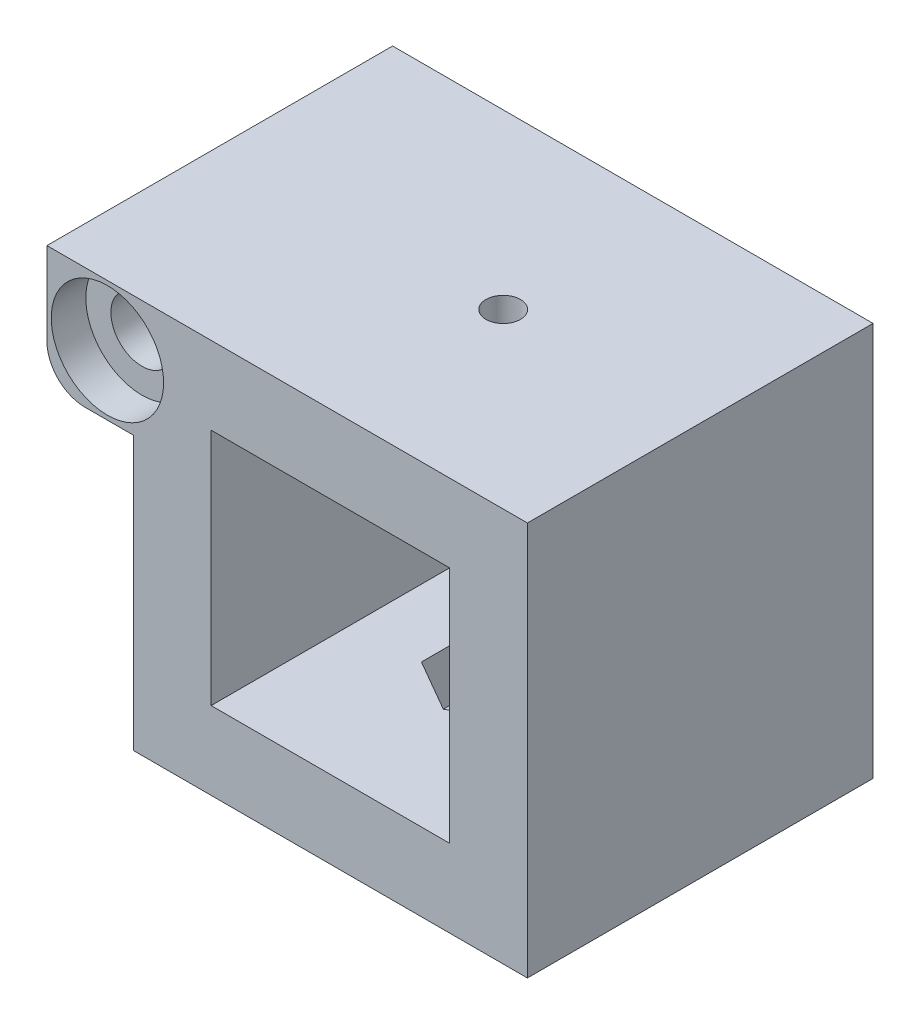
ISO-10303-21;
HEADER;
FILE_DESCRIPTION(('STEP AP214'),'2;1');
FILE_NAME('part.step','',(''),(''),'','','');
FILE_SCHEMA(('AUTOMOTIVE_DESIGN { 1 0 10303 214 1 1 1 1 }'));
ENDSEC;
DATA;
#1=APPLICATION_CONTEXT('core data for automotive mechanical design processes');
#2=APPLICATION_PROTOCOL_DEFINITION('international standard','automotive_design',2000,#1);
#3=PRODUCT_CONTEXT('',#1,'mechanical');
#4=PRODUCT('Part','Part','',(#3));
#5=PRODUCT_RELATED_PRODUCT_CATEGORY('part','',(#4));
#6=PRODUCT_DEFINITION_FORMATION('','',#4);
#7=PRODUCT_DEFINITION_CONTEXT('part definition',#1,'design');
#8=PRODUCT_DEFINITION('design','',#6,#7);
#9=PRODUCT_DEFINITION_SHAPE('','',#8);
#10=(LENGTH_UNIT() NAMED_UNIT(*) SI_UNIT(.MILLI.,.METRE.));
#11=(NAMED_UNIT(*) PLANE_ANGLE_UNIT() SI_UNIT($,.RADIAN.));
#12=(NAMED_UNIT(*) SI_UNIT($,.STERADIAN.) SOLID_ANGLE_UNIT());
#13=UNCERTAINTY_MEASURE_WITH_UNIT(LENGTH_MEASURE(1.E-05),#10,'distance_accuracy_value','');
#14=(GEOMETRIC_REPRESENTATION_CONTEXT(3) GLOBAL_UNCERTAINTY_ASSIGNED_CONTEXT((#13)) GLOBAL_UNIT_ASSIGNED_CONTEXT((#10,
#11,#12)) REPRESENTATION_CONTEXT('',''));
#15=CARTESIAN_POINT('',(0.,0.,0.));
#16=DIRECTION('',(0.,0.,1.));
#17=DIRECTION('',(1.,0.,0.));
#18=AXIS2_PLACEMENT_3D('',#15,#16,#17);
#19=CARTESIAN_POINT('',(-11.4,-11.4,10.));
#20=DIRECTION('',(1.,0.,0.));
#21=DIRECTION('',(0.,0.,-1.));
#22=AXIS2_PLACEMENT_3D('',#19,#20,#21);
#23=PLANE('',#22);
#24=DIRECTION('',(0.,-1.,0.));
#25=VECTOR('',#24,1.);
#26=CARTESIAN_POINT('',(-11.4,-11.4,10.));
#27=LINE('',#26,#25);
#28=CARTESIAN_POINT('',(-11.4,4.4,10.));
#29=VERTEX_POINT('',#28);
#30=CARTESIAN_POINT('',(-11.4,-11.4,10.));
#31=VERTEX_POINT('',#30);
#32=EDGE_CURVE('E165',#29,#31,#27,.T.);
#33=ORIENTED_EDGE('',*,*,#32,.F.);
#34=DIRECTION('',(0.,0.,-1.));
#35=VECTOR('',#34,1.);
#36=CARTESIAN_POINT('',(-11.4,4.4,10.));
#37=LINE('',#36,#35);
#38=CARTESIAN_POINT('',(-11.4,4.4,-10.));
#39=VERTEX_POINT('',#38);
#40=EDGE_CURVE('E170',#29,#39,#37,.T.);
#41=ORIENTED_EDGE('',*,*,#40,.T.);
#42=DIRECTION('',(0.,-1.,0.));
#43=VECTOR('',#42,1.);
#44=CARTESIAN_POINT('',(-11.4,-11.4,-10.));
#45=LINE('',#44,#43);
#46=CARTESIAN_POINT('',(-11.4,-11.4,-10.));
#47=VERTEX_POINT('',#46);
#48=EDGE_CURVE('E269',#39,#47,#45,.T.);
#49=ORIENTED_EDGE('',*,*,#48,.T.);
#50=DIRECTION('',(0.,0.,-1.));
#51=VECTOR('',#50,1.);
#52=CARTESIAN_POINT('',(-11.4,-11.4,10.));
#53=LINE('',#52,#51);
#54=EDGE_CURVE('E272',#31,#47,#53,.T.);
#55=ORIENTED_EDGE('',*,*,#54,.F.);
#56=EDGE_LOOP('',(#33,#41,#49,#55));
#57=FACE_BOUND('',#56,.T.);
#58=ADVANCED_FACE('F35',(#57),#23,.F.);
#59=CARTESIAN_POINT('',(0.,0.,10.));
#60=DIRECTION('',(0.,0.,1.));
#61=DIRECTION('',(1.,0.,0.));
#62=AXIS2_PLACEMENT_3D('',#59,#60,#61);
#63=PLANE('',#62);
#64=CARTESIAN_POINT('',(-12.9,7.9,10.));
#65=DIRECTION('',(0.,0.,1.));
#66=DIRECTION('',(1.,0.,0.));
#67=AXIS2_PLACEMENT_3D('',#64,#65,#66);
#68=CIRCLE('',#67,3.25);
#69=CARTESIAN_POINT('',(-9.65,7.9,10.));
#70=VERTEX_POINT('',#69);
#71=EDGE_CURVE('E315',#70,#70,#68,.T.);
#72=ORIENTED_EDGE('',*,*,#71,.F.);
#73=EDGE_LOOP('',(#72));
#74=FACE_BOUND('',#73,.T.);
#75=DIRECTION('',(0.,-1.,0.));
#76=VECTOR('',#75,1.);
#77=CARTESIAN_POINT('',(-16.4,0.,10.));
#78=LINE('',#77,#76);
#79=CARTESIAN_POINT('',(-16.4,11.4,10.));
#80=VERTEX_POINT('',#79);
#81=CARTESIAN_POINT('',(-16.4,6.6,10.));
#82=VERTEX_POINT('',#81);
#83=EDGE_CURVE('E157',#80,#82,#78,.T.);
#84=ORIENTED_EDGE('',*,*,#83,.T.);
#85=CARTESIAN_POINT('',(-14.2,6.6,10.));
#86=DIRECTION('',(0.,0.,1.));
#87=DIRECTION('',(1.,0.,0.));
#88=AXIS2_PLACEMENT_3D('',#85,#86,#87);
#89=CIRCLE('',#88,2.2);
#90=CARTESIAN_POINT('',(-14.2,4.4,10.));
#91=VERTEX_POINT('',#90);
#92=EDGE_CURVE('E11',#82,#91,#89,.T.);
#93=ORIENTED_EDGE('',*,*,#92,.T.);
#94=DIRECTION('',(-1.,0.,0.));
#95=VECTOR('',#94,1.);
#96=CARTESIAN_POINT('',(0.,4.4,10.));
#97=LINE('',#96,#95);
#98=EDGE_CURVE('E171',#29,#91,#97,.T.);
#99=ORIENTED_EDGE('',*,*,#98,.F.);
#100=ORIENTED_EDGE('',*,*,#32,.T.);
#101=DIRECTION('',(1.,0.,0.));
#102=VECTOR('',#101,1.);
#103=CARTESIAN_POINT('',(-11.4,-11.4,10.));
#104=LINE('',#103,#102);
#105=CARTESIAN_POINT('',(11.4,-11.4,10.));
#106=VERTEX_POINT('',#105);
#107=EDGE_CURVE('E267',#31,#106,#104,.T.);
#108=ORIENTED_EDGE('',*,*,#107,.T.);
#109=DIRECTION('',(0.,1.,0.));
#110=VECTOR('',#109,1.);
#111=CARTESIAN_POINT('',(11.4,-11.4,10.));
#112=LINE('',#111,#110);
#113=CARTESIAN_POINT('',(11.4,11.4,10.));
#114=VERTEX_POINT('',#113);
#115=EDGE_CURVE('E160',#106,#114,#112,.T.);
#116=ORIENTED_EDGE('',*,*,#115,.T.);
#117=DIRECTION('',(-1.,0.,0.));
#118=VECTOR('',#117,1.);
#119=CARTESIAN_POINT('',(-11.4,11.4,10.));
#120=LINE('',#119,#118);
#121=EDGE_CURVE('E154',#114,#80,#120,.T.);
#122=ORIENTED_EDGE('',*,*,#121,.T.);
#123=EDGE_LOOP('',(#84,#93,#99,#100,#108,#116,#122));
#124=FACE_BOUND('',#123,.T.);
#125=DIRECTION('',(-1.,0.,0.));
#126=VECTOR('',#125,1.);
#127=CARTESIAN_POINT('',(-6.9,6.9,10.));
#128=LINE('',#127,#126);
#129=CARTESIAN_POINT('',(6.9,6.9,10.));
#130=VERTEX_POINT('',#129);
#131=CARTESIAN_POINT('',(-6.9,6.9,10.));
#132=VERTEX_POINT('',#131);
#133=EDGE_CURVE('E238',#130,#132,#128,.T.);
#134=ORIENTED_EDGE('',*,*,#133,.F.);
#135=DIRECTION('',(0.,1.,0.));
#136=VECTOR('',#135,1.);
#137=CARTESIAN_POINT('',(6.9,-6.9,10.));
#138=LINE('',#137,#136);
#139=CARTESIAN_POINT('',(6.9,-6.9,10.));
#140=VERTEX_POINT('',#139);
#141=EDGE_CURVE('E236',#140,#130,#138,.T.);
#142=ORIENTED_EDGE('',*,*,#141,.F.);
#143=DIRECTION('',(1.,0.,0.));
#144=VECTOR('',#143,1.);
#145=CARTESIAN_POINT('',(-6.9,-6.9,10.));
#146=LINE('',#145,#144);
#147=CARTESIAN_POINT('',(-6.9,-6.9,10.));
#148=VERTEX_POINT('',#147);
#149=EDGE_CURVE('E244',#148,#140,#146,.T.);
#150=ORIENTED_EDGE('',*,*,#149,.F.);
#151=DIRECTION('',(0.,-1.,0.));
#152=VECTOR('',#151,1.);
#153=CARTESIAN_POINT('',(-6.9,-6.9,10.));
#154=LINE('',#153,#152);
#155=EDGE_CURVE('E241',#132,#148,#154,.T.);
#156=ORIENTED_EDGE('',*,*,#155,.F.);
#157=EDGE_LOOP('',(#134,#142,#150,#156));
#158=FACE_BOUND('',#157,.T.);
#159=ADVANCED_FACE('F155',(#74,#124,#158),#63,.T.);
#160=CARTESIAN_POINT('',(0.,0.,-10.));
#161=DIRECTION('',(0.,0.,1.));
#162=DIRECTION('',(1.,0.,0.));
#163=AXIS2_PLACEMENT_3D('',#160,#161,#162);
#164=PLANE('',#163);
#165=CARTESIAN_POINT('',(-12.9,7.9,-10.));
#166=DIRECTION('',(0.,0.,1.));
#167=DIRECTION('',(1.,0.,0.));
#168=AXIS2_PLACEMENT_3D('',#165,#166,#167);
#169=CIRCLE('',#168,1.79999999999999);
#170=CARTESIAN_POINT('',(-11.1,7.9,-10.));
#171=VERTEX_POINT('',#170);
#172=EDGE_CURVE('E304',#171,#171,#169,.T.);
#173=ORIENTED_EDGE('',*,*,#172,.T.);
#174=EDGE_LOOP('',(#173));
#175=FACE_BOUND('',#174,.T.);
#176=DIRECTION('',(-1.,0.,0.));
#177=VECTOR('',#176,1.);
#178=CARTESIAN_POINT('',(0.,4.4,-10.));
#179=LINE('',#178,#177);
#180=CARTESIAN_POINT('',(-14.2,4.4,-10.));
#181=VERTEX_POINT('',#180);
#182=EDGE_CURVE('E298',#39,#181,#179,.T.);
#183=ORIENTED_EDGE('',*,*,#182,.T.);
#184=CARTESIAN_POINT('',(-14.2,6.6,-10.));
#185=DIRECTION('',(0.,0.,1.));
#186=DIRECTION('',(1.,0.,0.));
#187=AXIS2_PLACEMENT_3D('',#184,#185,#186);
#188=CIRCLE('',#187,2.2);
#189=CARTESIAN_POINT('',(-16.4,6.6,-10.));
#190=VERTEX_POINT('',#189);
#191=EDGE_CURVE('E58',#181,#190,#188,.F.);
#192=ORIENTED_EDGE('',*,*,#191,.T.);
#193=DIRECTION('',(0.,-1.,0.));
#194=VECTOR('',#193,1.);
#195=CARTESIAN_POINT('',(-16.4,0.,-10.));
#196=LINE('',#195,#194);
#197=CARTESIAN_POINT('',(-16.4,11.4,-10.));
#198=VERTEX_POINT('',#197);
#199=EDGE_CURVE('E184',#198,#190,#196,.T.);
#200=ORIENTED_EDGE('',*,*,#199,.F.);
#201=DIRECTION('',(-1.,0.,0.));
#202=VECTOR('',#201,1.);
#203=CARTESIAN_POINT('',(-11.4,11.4,-10.));
#204=LINE('',#203,#202);
#205=CARTESIAN_POINT('',(11.4,11.4,-10.));
#206=VERTEX_POINT('',#205);
#207=EDGE_CURVE('E175',#206,#198,#204,.T.);
#208=ORIENTED_EDGE('',*,*,#207,.F.);
#209=DIRECTION('',(0.,1.,0.));
#210=VECTOR('',#209,1.);
#211=CARTESIAN_POINT('',(11.4,-11.4,-10.));
#212=LINE('',#211,#210);
#213=CARTESIAN_POINT('',(11.4,-11.4,-10.));
#214=VERTEX_POINT('',#213);
#215=EDGE_CURVE('E275',#214,#206,#212,.T.);
#216=ORIENTED_EDGE('',*,*,#215,.F.);
#217=DIRECTION('',(1.,0.,0.));
#218=VECTOR('',#217,1.);
#219=CARTESIAN_POINT('',(-11.4,-11.4,-10.));
#220=LINE('',#219,#218);
#221=EDGE_CURVE('E266',#47,#214,#220,.T.);
#222=ORIENTED_EDGE('',*,*,#221,.F.);
#223=ORIENTED_EDGE('',*,*,#48,.F.);
#224=EDGE_LOOP('',(#183,#192,#200,#208,#216,#222,#223));
#225=FACE_BOUND('',#224,.T.);
#226=DIRECTION('',(0.,1.,0.));
#227=VECTOR('',#226,1.);
#228=CARTESIAN_POINT('',(6.9,-6.9,-10.));
#229=LINE('',#228,#227);
#230=CARTESIAN_POINT('',(6.9,-6.9,-10.));
#231=VERTEX_POINT('',#230);
#232=CARTESIAN_POINT('',(6.9,6.9,-10.));
#233=VERTEX_POINT('',#232);
#234=EDGE_CURVE('E225',#231,#233,#229,.T.);
#235=ORIENTED_EDGE('',*,*,#234,.T.);
#236=DIRECTION('',(-1.,0.,0.));
#237=VECTOR('',#236,1.);
#238=CARTESIAN_POINT('',(-6.9,6.9,-10.));
#239=LINE('',#238,#237);
#240=CARTESIAN_POINT('',(-6.9,6.9,-10.));
#241=VERTEX_POINT('',#240);
#242=EDGE_CURVE('E249',#233,#241,#239,.T.);
#243=ORIENTED_EDGE('',*,*,#242,.T.);
#244=DIRECTION('',(0.,-1.,0.));
#245=VECTOR('',#244,1.);
#246=CARTESIAN_POINT('',(-6.9,-6.9,-10.));
#247=LINE('',#246,#245);
#248=CARTESIAN_POINT('',(-6.9,-6.9,-10.));
#249=VERTEX_POINT('',#248);
#250=EDGE_CURVE('E252',#241,#249,#247,.T.);
#251=ORIENTED_EDGE('',*,*,#250,.T.);
#252=DIRECTION('',(1.,0.,0.));
#253=VECTOR('',#252,1.);
#254=CARTESIAN_POINT('',(-6.9,-6.9,-10.));
#255=LINE('',#254,#253);
#256=EDGE_CURVE('E239',#249,#231,#255,.T.);
#257=ORIENTED_EDGE('',*,*,#256,.T.);
#258=EDGE_LOOP('',(#235,#243,#251,#257));
#259=FACE_BOUND('',#258,.T.);
#260=ADVANCED_FACE('F301',(#175,#225,#259),#164,.F.);
#261=CARTESIAN_POINT('',(-11.4,-11.4,10.));
#262=DIRECTION('',(0.,1.,0.));
#263=DIRECTION('',(0.,0.,1.));
#264=AXIS2_PLACEMENT_3D('',#261,#262,#263);
#265=PLANE('',#264);
#266=CARTESIAN_POINT('',(0.,-11.4,0.));
#267=DIRECTION('',(0.,1.,0.));
#268=DIRECTION('',(0.,0.,1.));
#269=AXIS2_PLACEMENT_3D('',#266,#267,#268);
#270=CIRCLE('',#269,1.75);
#271=CARTESIAN_POINT('',(0.,-11.4,1.75));
#272=VERTEX_POINT('',#271);
#273=EDGE_CURVE('E179',#272,#272,#270,.T.);
#274=ORIENTED_EDGE('',*,*,#273,.T.);
#275=EDGE_LOOP('',(#274));
#276=FACE_BOUND('',#275,.T.);
#277=ORIENTED_EDGE('',*,*,#221,.T.);
#278=DIRECTION('',(0.,0.,-1.));
#279=VECTOR('',#278,1.);
#280=CARTESIAN_POINT('',(11.4,-11.4,10.));
#281=LINE('',#280,#279);
#282=EDGE_CURVE('E283',#106,#214,#281,.T.);
#283=ORIENTED_EDGE('',*,*,#282,.F.);
#284=ORIENTED_EDGE('',*,*,#107,.F.);
#285=ORIENTED_EDGE('',*,*,#54,.T.);
#286=EDGE_LOOP('',(#277,#283,#284,#285));
#287=FACE_BOUND('',#286,.T.);
#288=ADVANCED_FACE('F369',(#276,#287),#265,.F.);
#289=CARTESIAN_POINT('',(11.4,-11.4,10.));
#290=DIRECTION('',(-1.,0.,0.));
#291=DIRECTION('',(0.,-1.,0.));
#292=AXIS2_PLACEMENT_3D('',#289,#290,#291);
#293=PLANE('',#292);
#294=ORIENTED_EDGE('',*,*,#215,.T.);
#295=DIRECTION('',(0.,0.,-1.));
#296=VECTOR('',#295,1.);
#297=CARTESIAN_POINT('',(11.4,11.4,10.));
#298=LINE('',#297,#296);
#299=EDGE_CURVE('E281',#114,#206,#298,.T.);
#300=ORIENTED_EDGE('',*,*,#299,.F.);
#301=ORIENTED_EDGE('',*,*,#115,.F.);
#302=ORIENTED_EDGE('',*,*,#282,.T.);
#303=EDGE_LOOP('',(#294,#300,#301,#302));
#304=FACE_BOUND('',#303,.T.);
#305=ADVANCED_FACE('F366',(#304),#293,.F.);
#306=CARTESIAN_POINT('',(-11.4,11.4,10.));
#307=DIRECTION('',(0.,-1.,0.));
#308=DIRECTION('',(0.,0.,-1.));
#309=AXIS2_PLACEMENT_3D('',#306,#307,#308);
#310=PLANE('',#309);
#311=CARTESIAN_POINT('',(0.,11.4,0.));
#312=DIRECTION('',(0.,1.,0.));
#313=DIRECTION('',(0.,0.,1.));
#314=AXIS2_PLACEMENT_3D('',#311,#312,#313);
#315=CIRCLE('',#314,1.);
#316=CARTESIAN_POINT('',(0.,11.4,1.));
#317=VERTEX_POINT('',#316);
#318=EDGE_CURVE('E318',#317,#317,#315,.T.);
#319=ORIENTED_EDGE('',*,*,#318,.F.);
#320=EDGE_LOOP('',(#319));
#321=FACE_BOUND('',#320,.T.);
#322=ORIENTED_EDGE('',*,*,#207,.T.);
#323=DIRECTION('',(0.,0.,-1.));
#324=VECTOR('',#323,1.);
#325=CARTESIAN_POINT('',(-16.4,11.4,10.));
#326=LINE('',#325,#324);
#327=EDGE_CURVE('E169',#80,#198,#326,.T.);
#328=ORIENTED_EDGE('',*,*,#327,.F.);
#329=ORIENTED_EDGE('',*,*,#121,.F.);
#330=ORIENTED_EDGE('',*,*,#299,.T.);
#331=EDGE_LOOP('',(#322,#328,#329,#330));
#332=FACE_BOUND('',#331,.T.);
#333=ADVANCED_FACE('F173',(#321,#332),#310,.F.);
#334=CARTESIAN_POINT('',(6.9,-6.9,10.));
#335=DIRECTION('',(-1.,0.,0.));
#336=DIRECTION('',(0.,0.,1.));
#337=AXIS2_PLACEMENT_3D('',#334,#335,#336);
#338=PLANE('',#337);
#339=ORIENTED_EDGE('',*,*,#234,.F.);
#340=DIRECTION('',(0.,0.,-1.));
#341=VECTOR('',#340,1.);
#342=CARTESIAN_POINT('',(6.9,-6.9,10.));
#343=LINE('',#342,#341);
#344=EDGE_CURVE('E246',#140,#231,#343,.T.);
#345=ORIENTED_EDGE('',*,*,#344,.F.);
#346=ORIENTED_EDGE('',*,*,#141,.T.);
#347=DIRECTION('',(0.,0.,-1.));
#348=VECTOR('',#347,1.);
#349=CARTESIAN_POINT('',(6.9,6.9,10.));
#350=LINE('',#349,#348);
#351=EDGE_CURVE('E263',#130,#233,#350,.T.);
#352=ORIENTED_EDGE('',*,*,#351,.T.);
#353=EDGE_LOOP('',(#339,#345,#346,#352));
#354=FACE_BOUND('',#353,.T.);
#355=ADVANCED_FACE('F331',(#354),#338,.T.);
#356=CARTESIAN_POINT('',(-6.9,6.9,10.));
#357=DIRECTION('',(0.,-1.,0.));
#358=DIRECTION('',(0.,0.,-1.));
#359=AXIS2_PLACEMENT_3D('',#356,#357,#358);
#360=PLANE('',#359);
#361=CARTESIAN_POINT('',(0.,6.9,0.));
#362=DIRECTION('',(0.,-1.,0.));
#363=DIRECTION('',(0.,0.,-1.));
#364=AXIS2_PLACEMENT_3D('',#361,#362,#363);
#365=CIRCLE('',#364,1.);
#366=CARTESIAN_POINT('',(0.,6.9,-1.));
#367=VERTEX_POINT('',#366);
#368=EDGE_CURVE('E39',#367,#367,#365,.T.);
#369=ORIENTED_EDGE('',*,*,#368,.F.);
#370=EDGE_LOOP('',(#369));
#371=FACE_BOUND('',#370,.T.);
#372=ORIENTED_EDGE('',*,*,#242,.F.);
#373=ORIENTED_EDGE('',*,*,#351,.F.);
#374=ORIENTED_EDGE('',*,*,#133,.T.);
#375=DIRECTION('',(0.,0.,-1.));
#376=VECTOR('',#375,1.);
#377=CARTESIAN_POINT('',(-6.9,6.9,10.));
#378=LINE('',#377,#376);
#379=EDGE_CURVE('E261',#132,#241,#378,.T.);
#380=ORIENTED_EDGE('',*,*,#379,.T.);
#381=EDGE_LOOP('',(#372,#373,#374,#380));
#382=FACE_BOUND('',#381,.T.);
#383=ADVANCED_FACE('F327',(#371,#382),#360,.T.);
#384=CARTESIAN_POINT('',(-6.9,-6.9,10.));
#385=DIRECTION('',(1.,0.,0.));
#386=DIRECTION('',(0.,0.,-1.));
#387=AXIS2_PLACEMENT_3D('',#384,#385,#386);
#388=PLANE('',#387);
#389=ORIENTED_EDGE('',*,*,#250,.F.);
#390=ORIENTED_EDGE('',*,*,#379,.F.);
#391=ORIENTED_EDGE('',*,*,#155,.T.);
#392=DIRECTION('',(0.,0.,-1.));
#393=VECTOR('',#392,1.);
#394=CARTESIAN_POINT('',(-6.9,-6.9,10.));
#395=LINE('',#394,#393);
#396=EDGE_CURVE('E259',#148,#249,#395,.T.);
#397=ORIENTED_EDGE('',*,*,#396,.T.);
#398=EDGE_LOOP('',(#389,#390,#391,#397));
#399=FACE_BOUND('',#398,.T.);
#400=ADVANCED_FACE('F330',(#399),#388,.T.);
#401=CARTESIAN_POINT('',(-6.9,-6.9,10.));
#402=DIRECTION('',(0.,1.,0.));
#403=DIRECTION('',(0.,0.,1.));
#404=AXIS2_PLACEMENT_3D('',#401,#402,#403);
#405=PLANE('',#404);
#406=DIRECTION('',(0.866025403784438,0.,-0.5));
#407=VECTOR('',#406,1.);
#408=CARTESIAN_POINT('',(0.,-6.9,3.46410161513775));
#409=LINE('',#408,#407);
#410=CARTESIAN_POINT('',(0.,-6.9,3.46410161513775));
#411=VERTEX_POINT('',#410);
#412=CARTESIAN_POINT('',(3.,-6.9,1.73205080756888));
#413=VERTEX_POINT('',#412);
#414=EDGE_CURVE('E207',#411,#413,#409,.T.);
#415=ORIENTED_EDGE('',*,*,#414,.F.);
#416=DIRECTION('',(0.866025403784439,0.,0.5));
#417=VECTOR('',#416,1.);
#418=CARTESIAN_POINT('',(-3.,-6.9,1.73205080756888));
#419=LINE('',#418,#417);
#420=CARTESIAN_POINT('',(-3.,-6.9,1.73205080756888));
#421=VERTEX_POINT('',#420);
#422=EDGE_CURVE('E191',#421,#411,#419,.T.);
#423=ORIENTED_EDGE('',*,*,#422,.F.);
#424=DIRECTION('',(0.,0.,1.));
#425=VECTOR('',#424,1.);
#426=CARTESIAN_POINT('',(-3.,-6.9,-1.73205080756888));
#427=LINE('',#426,#425);
#428=CARTESIAN_POINT('',(-3.,-6.9,-1.73205080756888));
#429=VERTEX_POINT('',#428);
#430=EDGE_CURVE('E218',#429,#421,#427,.T.);
#431=ORIENTED_EDGE('',*,*,#430,.F.);
#432=DIRECTION('',(-0.866025403784438,0.,0.5));
#433=VECTOR('',#432,1.);
#434=CARTESIAN_POINT('',(0.,-6.9,-3.46410161513775));
#435=LINE('',#434,#433);
#436=CARTESIAN_POINT('',(0.,-6.9,-3.46410161513775));
#437=VERTEX_POINT('',#436);
#438=EDGE_CURVE('E215',#437,#429,#435,.T.);
#439=ORIENTED_EDGE('',*,*,#438,.F.);
#440=DIRECTION('',(-0.866025403784439,0.,-0.5));
#441=VECTOR('',#440,1.);
#442=CARTESIAN_POINT('',(3.,-6.9,-1.73205080756888));
#443=LINE('',#442,#441);
#444=CARTESIAN_POINT('',(3.,-6.9,-1.73205080756888));
#445=VERTEX_POINT('',#444);
#446=EDGE_CURVE('E212',#445,#437,#443,.T.);
#447=ORIENTED_EDGE('',*,*,#446,.F.);
#448=DIRECTION('',(0.,0.,-1.));
#449=VECTOR('',#448,1.);
#450=CARTESIAN_POINT('',(3.,-6.9,1.73205080756888));
#451=LINE('',#450,#449);
#452=EDGE_CURVE('E209',#413,#445,#451,.T.);
#453=ORIENTED_EDGE('',*,*,#452,.F.);
#454=EDGE_LOOP('',(#415,#423,#431,#439,#447,#453));
#455=FACE_BOUND('',#454,.T.);
#456=ORIENTED_EDGE('',*,*,#256,.F.);
#457=ORIENTED_EDGE('',*,*,#396,.F.);
#458=ORIENTED_EDGE('',*,*,#149,.T.);
#459=ORIENTED_EDGE('',*,*,#344,.T.);
#460=EDGE_LOOP('',(#456,#457,#458,#459));
#461=FACE_BOUND('',#460,.T.);
#462=ADVANCED_FACE('F342',(#455,#461),#405,.T.);
#463=CARTESIAN_POINT('',(0.,-9.9,3.46410161513775));
#464=DIRECTION('',(0.5,0.,0.866025403784439));
#465=DIRECTION('',(0.866025403784439,0.,-0.5));
#466=AXIS2_PLACEMENT_3D('',#463,#464,#465);
#467=PLANE('',#466);
#468=ORIENTED_EDGE('',*,*,#414,.T.);
#469=DIRECTION('',(0.,1.,0.));
#470=VECTOR('',#469,1.);
#471=CARTESIAN_POINT('',(3.,-9.9,1.73205080756888));
#472=LINE('',#471,#470);
#473=CARTESIAN_POINT('',(3.,-9.9,1.73205080756888));
#474=VERTEX_POINT('',#473);
#475=EDGE_CURVE('E206',#474,#413,#472,.T.);
#476=ORIENTED_EDGE('',*,*,#475,.F.);
#477=DIRECTION('',(0.866025403784438,0.,-0.5));
#478=VECTOR('',#477,1.);
#479=CARTESIAN_POINT('',(0.,-9.9,3.46410161513775));
#480=LINE('',#479,#478);
#481=CARTESIAN_POINT('',(0.,-9.9,3.46410161513775));
#482=VERTEX_POINT('',#481);
#483=EDGE_CURVE('E187',#482,#474,#480,.T.);
#484=ORIENTED_EDGE('',*,*,#483,.F.);
#485=DIRECTION('',(0.,1.,0.));
#486=VECTOR('',#485,1.);
#487=CARTESIAN_POINT('',(0.,-9.9,3.46410161513775));
#488=LINE('',#487,#486);
#489=EDGE_CURVE('E223',#482,#411,#488,.T.);
#490=ORIENTED_EDGE('',*,*,#489,.T.);
#491=EDGE_LOOP('',(#468,#476,#484,#490));
#492=FACE_BOUND('',#491,.T.);
#493=ADVANCED_FACE('F351',(#492),#467,.F.);
#494=CARTESIAN_POINT('',(-3.,-9.9,1.73205080756888));
#495=DIRECTION('',(-0.5,0.,0.866025403784439));
#496=DIRECTION('',(0.866025403784439,0.,0.5));
#497=AXIS2_PLACEMENT_3D('',#494,#495,#496);
#498=PLANE('',#497);
#499=ORIENTED_EDGE('',*,*,#422,.T.);
#500=ORIENTED_EDGE('',*,*,#489,.F.);
#501=DIRECTION('',(0.866025403784439,0.,0.5));
#502=VECTOR('',#501,1.);
#503=CARTESIAN_POINT('',(-3.,-9.9,1.73205080756888));
#504=LINE('',#503,#502);
#505=CARTESIAN_POINT('',(-3.,-9.9,1.73205080756888));
#506=VERTEX_POINT('',#505);
#507=EDGE_CURVE('E203',#506,#482,#504,.T.);
#508=ORIENTED_EDGE('',*,*,#507,.F.);
#509=DIRECTION('',(0.,1.,0.));
#510=VECTOR('',#509,1.);
#511=CARTESIAN_POINT('',(-3.,-9.9,1.73205080756888));
#512=LINE('',#511,#510);
#513=EDGE_CURVE('E226',#506,#421,#512,.T.);
#514=ORIENTED_EDGE('',*,*,#513,.T.);
#515=EDGE_LOOP('',(#499,#500,#508,#514));
#516=FACE_BOUND('',#515,.T.);
#517=ADVANCED_FACE('F417',(#516),#498,.F.);
#518=CARTESIAN_POINT('',(-3.,-9.9,-1.73205080756888));
#519=DIRECTION('',(-1.,0.,0.));
#520=DIRECTION('',(0.,0.,1.));
#521=AXIS2_PLACEMENT_3D('',#518,#519,#520);
#522=PLANE('',#521);
#523=ORIENTED_EDGE('',*,*,#430,.T.);
#524=ORIENTED_EDGE('',*,*,#513,.F.);
#525=DIRECTION('',(0.,0.,1.));
#526=VECTOR('',#525,1.);
#527=CARTESIAN_POINT('',(-3.,-9.9,-1.73205080756888));
#528=LINE('',#527,#526);
#529=CARTESIAN_POINT('',(-3.,-9.9,-1.73205080756888));
#530=VERTEX_POINT('',#529);
#531=EDGE_CURVE('E200',#530,#506,#528,.T.);
#532=ORIENTED_EDGE('',*,*,#531,.F.);
#533=DIRECTION('',(0.,1.,0.));
#534=VECTOR('',#533,1.);
#535=CARTESIAN_POINT('',(-3.,-9.9,-1.73205080756888));
#536=LINE('',#535,#534);
#537=EDGE_CURVE('E228',#530,#429,#536,.T.);
#538=ORIENTED_EDGE('',*,*,#537,.T.);
#539=EDGE_LOOP('',(#523,#524,#532,#538));
#540=FACE_BOUND('',#539,.T.);
#541=ADVANCED_FACE('F420',(#540),#522,.F.);
#542=CARTESIAN_POINT('',(0.,-9.9,-3.46410161513775));
#543=DIRECTION('',(-0.5,0.,-0.866025403784438));
#544=DIRECTION('',(-0.866025403784438,0.,0.5));
#545=AXIS2_PLACEMENT_3D('',#542,#543,#544);
#546=PLANE('',#545);
#547=ORIENTED_EDGE('',*,*,#438,.T.);
#548=ORIENTED_EDGE('',*,*,#537,.F.);
#549=DIRECTION('',(-0.866025403784438,0.,0.5));
#550=VECTOR('',#549,1.);
#551=CARTESIAN_POINT('',(0.,-9.9,-3.46410161513775));
#552=LINE('',#551,#550);
#553=CARTESIAN_POINT('',(0.,-9.9,-3.46410161513775));
#554=VERTEX_POINT('',#553);
#555=EDGE_CURVE('E197',#554,#530,#552,.T.);
#556=ORIENTED_EDGE('',*,*,#555,.F.);
#557=DIRECTION('',(0.,1.,0.));
#558=VECTOR('',#557,1.);
#559=CARTESIAN_POINT('',(0.,-9.9,-3.46410161513775));
#560=LINE('',#559,#558);
#561=EDGE_CURVE('E230',#554,#437,#560,.T.);
#562=ORIENTED_EDGE('',*,*,#561,.T.);
#563=EDGE_LOOP('',(#547,#548,#556,#562));
#564=FACE_BOUND('',#563,.T.);
#565=ADVANCED_FACE('F424',(#564),#546,.F.);
#566=CARTESIAN_POINT('',(3.,-9.9,-1.73205080756888));
#567=DIRECTION('',(0.5,0.,-0.866025403784439));
#568=DIRECTION('',(-0.866025403784439,0.,-0.5));
#569=AXIS2_PLACEMENT_3D('',#566,#567,#568);
#570=PLANE('',#569);
#571=ORIENTED_EDGE('',*,*,#446,.T.);
#572=ORIENTED_EDGE('',*,*,#561,.F.);
#573=DIRECTION('',(-0.866025403784439,0.,-0.5));
#574=VECTOR('',#573,1.);
#575=CARTESIAN_POINT('',(3.,-9.9,-1.73205080756888));
#576=LINE('',#575,#574);
#577=CARTESIAN_POINT('',(3.,-9.9,-1.73205080756888));
#578=VERTEX_POINT('',#577);
#579=EDGE_CURVE('E194',#578,#554,#576,.T.);
#580=ORIENTED_EDGE('',*,*,#579,.F.);
#581=DIRECTION('',(0.,1.,0.));
#582=VECTOR('',#581,1.);
#583=CARTESIAN_POINT('',(3.,-9.9,-1.73205080756888));
#584=LINE('',#583,#582);
#585=EDGE_CURVE('E232',#578,#445,#584,.T.);
#586=ORIENTED_EDGE('',*,*,#585,.T.);
#587=EDGE_LOOP('',(#571,#572,#580,#586));
#588=FACE_BOUND('',#587,.T.);
#589=ADVANCED_FACE('F428',(#588),#570,.F.);
#590=CARTESIAN_POINT('',(3.,-9.9,1.73205080756888));
#591=DIRECTION('',(1.,0.,0.));
#592=DIRECTION('',(0.,0.,-1.));
#593=AXIS2_PLACEMENT_3D('',#590,#591,#592);
#594=PLANE('',#593);
#595=ORIENTED_EDGE('',*,*,#452,.T.);
#596=ORIENTED_EDGE('',*,*,#585,.F.);
#597=DIRECTION('',(0.,0.,-1.));
#598=VECTOR('',#597,1.);
#599=CARTESIAN_POINT('',(3.,-9.9,1.73205080756888));
#600=LINE('',#599,#598);
#601=EDGE_CURVE('E190',#474,#578,#600,.T.);
#602=ORIENTED_EDGE('',*,*,#601,.F.);
#603=ORIENTED_EDGE('',*,*,#475,.T.);
#604=EDGE_LOOP('',(#595,#596,#602,#603));
#605=FACE_BOUND('',#604,.T.);
#606=ADVANCED_FACE('F415',(#605),#594,.F.);
#607=CARTESIAN_POINT('',(0.,-9.9,0.));
#608=DIRECTION('',(0.,1.,0.));
#609=DIRECTION('',(0.,0.,1.));
#610=AXIS2_PLACEMENT_3D('',#607,#608,#609);
#611=PLANE('',#610);
#612=CARTESIAN_POINT('',(0.,-9.9,0.));
#613=DIRECTION('',(0.,1.,0.));
#614=DIRECTION('',(0.,0.,1.));
#615=AXIS2_PLACEMENT_3D('',#612,#613,#614);
#616=CIRCLE('',#615,1.75);
#617=CARTESIAN_POINT('',(0.,-9.9,1.75));
#618=VERTEX_POINT('',#617);
#619=EDGE_CURVE('E176',#618,#618,#616,.T.);
#620=ORIENTED_EDGE('',*,*,#619,.F.);
#621=EDGE_LOOP('',(#620));
#622=FACE_BOUND('',#621,.T.);
#623=ORIENTED_EDGE('',*,*,#483,.T.);
#624=ORIENTED_EDGE('',*,*,#601,.T.);
#625=ORIENTED_EDGE('',*,*,#579,.T.);
#626=ORIENTED_EDGE('',*,*,#555,.T.);
#627=ORIENTED_EDGE('',*,*,#531,.T.);
#628=ORIENTED_EDGE('',*,*,#507,.T.);
#629=EDGE_LOOP('',(#623,#624,#625,#626,#627,#628));
#630=FACE_BOUND('',#629,.T.);
#631=ADVANCED_FACE('F411',(#622,#630),#611,.T.);
#632=CARTESIAN_POINT('',(0.,-12.9,0.));
#633=DIRECTION('',(0.,1.,0.));
#634=DIRECTION('',(0.,0.,1.));
#635=AXIS2_PLACEMENT_3D('',#632,#633,#634);
#636=CYLINDRICAL_SURFACE('',#635,1.75);
#637=ORIENTED_EDGE('',*,*,#619,.T.);
#638=EDGE_LOOP('',(#637));
#639=FACE_BOUND('',#638,.T.);
#640=ORIENTED_EDGE('',*,*,#273,.F.);
#641=EDGE_LOOP('',(#640));
#642=FACE_BOUND('',#641,.T.);
#643=ADVANCED_FACE('F406',(#639,#642),#636,.F.);
#644=CARTESIAN_POINT('',(-16.4,0.,10.));
#645=DIRECTION('',(1.,0.,0.));
#646=DIRECTION('',(0.,0.,-1.));
#647=AXIS2_PLACEMENT_3D('',#644,#645,#646);
#648=PLANE('',#647);
#649=ORIENTED_EDGE('',*,*,#199,.T.);
#650=DIRECTION('',(0.,0.,-1.));
#651=VECTOR('',#650,1.);
#652=CARTESIAN_POINT('',(-16.4,6.6,10.));
#653=LINE('',#652,#651);
#654=EDGE_CURVE('E44',#190,#82,#653,.F.);
#655=ORIENTED_EDGE('',*,*,#654,.T.);
#656=ORIENTED_EDGE('',*,*,#83,.F.);
#657=ORIENTED_EDGE('',*,*,#327,.T.);
#658=EDGE_LOOP('',(#649,#655,#656,#657));
#659=FACE_BOUND('',#658,.T.);
#660=ADVANCED_FACE('F168',(#659),#648,.F.);
#661=CARTESIAN_POINT('',(0.,4.4,10.));
#662=DIRECTION('',(0.,-1.,0.));
#663=DIRECTION('',(0.,0.,-1.));
#664=AXIS2_PLACEMENT_3D('',#661,#662,#663);
#665=PLANE('',#664);
#666=ORIENTED_EDGE('',*,*,#98,.T.);
#667=DIRECTION('',(0.,0.,-1.));
#668=VECTOR('',#667,1.);
#669=CARTESIAN_POINT('',(-14.2,4.4,-10.));
#670=LINE('',#669,#668);
#671=EDGE_CURVE('E286',#91,#181,#670,.T.);
#672=ORIENTED_EDGE('',*,*,#671,.T.);
#673=ORIENTED_EDGE('',*,*,#182,.F.);
#674=ORIENTED_EDGE('',*,*,#40,.F.);
#675=EDGE_LOOP('',(#666,#672,#673,#674));
#676=FACE_BOUND('',#675,.T.);
#677=ADVANCED_FACE('F296',(#676),#665,.T.);
#678=CARTESIAN_POINT('',(-12.9,7.9,10.));
#679=DIRECTION('',(0.,0.,1.));
#680=DIRECTION('',(1.,0.,0.));
#681=AXIS2_PLACEMENT_3D('',#678,#679,#680);
#682=CYLINDRICAL_SURFACE('',#681,1.8);
#683=ORIENTED_EDGE('',*,*,#172,.F.);
#684=EDGE_LOOP('',(#683));
#685=FACE_BOUND('',#684,.T.);
#686=CARTESIAN_POINT('',(-12.9,7.9,8.));
#687=DIRECTION('',(0.,0.,1.));
#688=DIRECTION('',(1.,0.,0.));
#689=AXIS2_PLACEMENT_3D('',#686,#687,#688);
#690=CIRCLE('',#689,1.8);
#691=CARTESIAN_POINT('',(-11.1,7.9,8.));
#692=VERTEX_POINT('',#691);
#693=EDGE_CURVE('E306',#692,#692,#690,.T.);
#694=ORIENTED_EDGE('',*,*,#693,.T.);
#695=EDGE_LOOP('',(#694));
#696=FACE_BOUND('',#695,.T.);
#697=ADVANCED_FACE('F395',(#685,#696),#682,.F.);
#698=CARTESIAN_POINT('',(-11.1,7.9,8.));
#699=DIRECTION('',(0.,0.,-1.));
#700=DIRECTION('',(-1.,0.,0.));
#701=AXIS2_PLACEMENT_3D('',#698,#699,#700);
#702=PLANE('',#701);
#703=ORIENTED_EDGE('',*,*,#693,.F.);
#704=EDGE_LOOP('',(#703));
#705=FACE_BOUND('',#704,.T.);
#706=CARTESIAN_POINT('',(-12.9,7.9,8.));
#707=DIRECTION('',(0.,0.,1.));
#708=DIRECTION('',(1.,0.,0.));
#709=AXIS2_PLACEMENT_3D('',#706,#707,#708);
#710=CIRCLE('',#709,3.25);
#711=CARTESIAN_POINT('',(-9.65,7.9,8.));
#712=VERTEX_POINT('',#711);
#713=EDGE_CURVE('E312',#712,#712,#710,.T.);
#714=ORIENTED_EDGE('',*,*,#713,.T.);
#715=EDGE_LOOP('',(#714));
#716=FACE_BOUND('',#715,.T.);
#717=ADVANCED_FACE('F389',(#705,#716),#702,.F.);
#718=CARTESIAN_POINT('',(-12.9,7.9,10.));
#719=DIRECTION('',(0.,0.,1.));
#720=DIRECTION('',(1.,0.,0.));
#721=AXIS2_PLACEMENT_3D('',#718,#719,#720);
#722=CYLINDRICAL_SURFACE('',#721,3.25);
#723=ORIENTED_EDGE('',*,*,#713,.F.);
#724=EDGE_LOOP('',(#723));
#725=FACE_BOUND('',#724,.T.);
#726=ORIENTED_EDGE('',*,*,#71,.T.);
#727=EDGE_LOOP('',(#726));
#728=FACE_BOUND('',#727,.T.);
#729=ADVANCED_FACE('F383',(#725,#728),#722,.F.);
#730=CARTESIAN_POINT('',(-14.2,6.6,10.));
#731=DIRECTION('',(0.,0.,1.));
#732=DIRECTION('',(1.,0.,0.));
#733=AXIS2_PLACEMENT_3D('',#730,#731,#732);
#734=CYLINDRICAL_SURFACE('',#733,2.2);
#735=ORIENTED_EDGE('',*,*,#92,.F.);
#736=ORIENTED_EDGE('',*,*,#654,.F.);
#737=ORIENTED_EDGE('',*,*,#191,.F.);
#738=ORIENTED_EDGE('',*,*,#671,.F.);
#739=EDGE_LOOP('',(#735,#736,#737,#738));
#740=FACE_BOUND('',#739,.T.);
#741=ADVANCED_FACE('F37',(#740),#734,.T.);
#742=CARTESIAN_POINT('',(0.,1.4,0.));
#743=DIRECTION('',(0.,1.,0.));
#744=DIRECTION('',(0.,0.,1.));
#745=AXIS2_PLACEMENT_3D('',#742,#743,#744);
#746=CYLINDRICAL_SURFACE('',#745,1.);
#747=ORIENTED_EDGE('',*,*,#368,.T.);
#748=EDGE_LOOP('',(#747));
#749=FACE_BOUND('',#748,.T.);
#750=ORIENTED_EDGE('',*,*,#318,.T.);
#751=EDGE_LOOP('',(#750));
#752=FACE_BOUND('',#751,.T.);
#753=ADVANCED_FACE('F325',(#749,#752),#746,.F.);
#754=CLOSED_SHELL('',(#58,#159,#260,#288,#305,#333,#355,#383,#400,#462,#493,#517,#541,#565,#589,
#606,#631,#643,#660,#677,#697,#717,#729,#741,#753));
#755=MANIFOLD_SOLID_BREP('B2',#754);
#756=ADVANCED_BREP_SHAPE_REPRESENTATION('',(#18,#755),#14);
#757=SHAPE_DEFINITION_REPRESENTATION(#9,#756);
ENDSEC;
END-ISO-10303-21;
